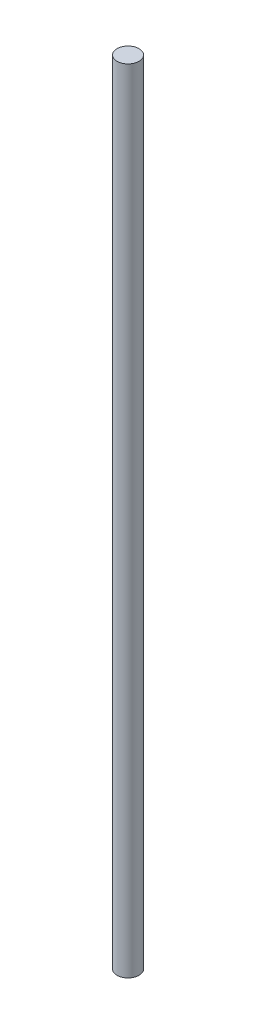
ISO-10303-21;
HEADER;
FILE_DESCRIPTION(('STEP AP214'),'2;1');
FILE_NAME('part.step','',(''),(''),'','','');
FILE_SCHEMA(('AUTOMOTIVE_DESIGN { 1 0 10303 214 1 1 1 1 }'));
ENDSEC;
DATA;
#1=APPLICATION_CONTEXT('core data for automotive mechanical design processes');
#2=APPLICATION_PROTOCOL_DEFINITION('international standard','automotive_design',2000,#1);
#3=PRODUCT_CONTEXT('',#1,'mechanical');
#4=PRODUCT('Part','Part','',(#3));
#5=PRODUCT_RELATED_PRODUCT_CATEGORY('part','',(#4));
#6=PRODUCT_DEFINITION_FORMATION('','',#4);
#7=PRODUCT_DEFINITION_CONTEXT('part definition',#1,'design');
#8=PRODUCT_DEFINITION('design','',#6,#7);
#9=PRODUCT_DEFINITION_SHAPE('','',#8);
#10=(LENGTH_UNIT() NAMED_UNIT(*) SI_UNIT(.MILLI.,.METRE.));
#11=(NAMED_UNIT(*) PLANE_ANGLE_UNIT() SI_UNIT($,.RADIAN.));
#12=(NAMED_UNIT(*) SI_UNIT($,.STERADIAN.) SOLID_ANGLE_UNIT());
#13=UNCERTAINTY_MEASURE_WITH_UNIT(LENGTH_MEASURE(1.E-05),#10,'distance_accuracy_value','');
#14=(GEOMETRIC_REPRESENTATION_CONTEXT(3) GLOBAL_UNCERTAINTY_ASSIGNED_CONTEXT((#13)) GLOBAL_UNIT_ASSIGNED_CONTEXT((#10,
#11,#12)) REPRESENTATION_CONTEXT('',''));
#15=CARTESIAN_POINT('',(0.,0.,0.));
#16=DIRECTION('',(0.,0.,1.));
#17=DIRECTION('',(1.,0.,0.));
#18=AXIS2_PLACEMENT_3D('',#15,#16,#17);
#19=CARTESIAN_POINT('',(0.,180.,0.));
#20=DIRECTION('',(0.,-1.,0.));
#21=DIRECTION('',(0.,0.,-1.));
#22=AXIS2_PLACEMENT_3D('',#19,#20,#21);
#23=CYLINDRICAL_SURFACE('',#22,2.5);
#24=CARTESIAN_POINT('',(0.,180.,0.));
#25=DIRECTION('',(0.,1.,0.));
#26=DIRECTION('',(0.,0.,1.));
#27=AXIS2_PLACEMENT_3D('',#24,#25,#26);
#28=CIRCLE('',#27,2.5);
#29=CARTESIAN_POINT('',(0.,180.,-2.5));
#30=VERTEX_POINT('',#29);
#31=EDGE_CURVE('E10',#30,#30,#28,.T.);
#32=CARTESIAN_POINT('',(0.,0.,0.));
#33=DIRECTION('',(0.,1.,0.));
#34=DIRECTION('',(0.,0.,1.));
#35=AXIS2_PLACEMENT_3D('',#32,#33,#34);
#36=CIRCLE('',#35,2.5);
#37=CARTESIAN_POINT('',(0.,0.,-2.5));
#38=VERTEX_POINT('',#37);
#39=EDGE_CURVE('E36',#38,#38,#36,.T.);
#40=CARTESIAN_POINT('',(0.,180.,-2.5));
#41=CARTESIAN_POINT('',(0.,178.125,-2.5));
#42=CARTESIAN_POINT('',(0.,176.25,-2.5));
#43=CARTESIAN_POINT('',(0.,172.5,-2.5));
#44=CARTESIAN_POINT('',(0.,170.625,-2.5));
#45=CARTESIAN_POINT('',(0.,166.875,-2.5));
#46=CARTESIAN_POINT('',(0.,165.,-2.5));
#47=CARTESIAN_POINT('',(0.,161.25,-2.5));
#48=CARTESIAN_POINT('',(0.,159.375,-2.5));
#49=CARTESIAN_POINT('',(0.,155.625,-2.5));
#50=CARTESIAN_POINT('',(0.,153.75,-2.5));
#51=CARTESIAN_POINT('',(0.,150.,-2.5));
#52=CARTESIAN_POINT('',(0.,148.125,-2.5));
#53=CARTESIAN_POINT('',(0.,144.375,-2.5));
#54=CARTESIAN_POINT('',(0.,142.5,-2.5));
#55=CARTESIAN_POINT('',(0.,138.75,-2.5));
#56=CARTESIAN_POINT('',(0.,136.875,-2.5));
#57=CARTESIAN_POINT('',(0.,133.125,-2.5));
#58=CARTESIAN_POINT('',(0.,131.25,-2.5));
#59=CARTESIAN_POINT('',(0.,127.5,-2.5));
#60=CARTESIAN_POINT('',(0.,125.625,-2.5));
#61=CARTESIAN_POINT('',(0.,121.875,-2.5));
#62=CARTESIAN_POINT('',(0.,120.,-2.5));
#63=CARTESIAN_POINT('',(0.,116.25,-2.5));
#64=CARTESIAN_POINT('',(0.,114.375,-2.5));
#65=CARTESIAN_POINT('',(0.,110.625,-2.5));
#66=CARTESIAN_POINT('',(0.,108.75,-2.5));
#67=CARTESIAN_POINT('',(0.,105.,-2.5));
#68=CARTESIAN_POINT('',(0.,103.125,-2.5));
#69=CARTESIAN_POINT('',(0.,99.375,-2.5));
#70=CARTESIAN_POINT('',(0.,97.5,-2.5));
#71=CARTESIAN_POINT('',(0.,93.75,-2.5));
#72=CARTESIAN_POINT('',(0.,91.875,-2.5));
#73=CARTESIAN_POINT('',(0.,88.125,-2.5));
#74=CARTESIAN_POINT('',(0.,86.25,-2.5));
#75=CARTESIAN_POINT('',(0.,82.5,-2.5));
#76=CARTESIAN_POINT('',(0.,80.625,-2.5));
#77=CARTESIAN_POINT('',(0.,76.875,-2.5));
#78=CARTESIAN_POINT('',(0.,75.,-2.5));
#79=CARTESIAN_POINT('',(0.,71.25,-2.5));
#80=CARTESIAN_POINT('',(0.,69.375,-2.5));
#81=CARTESIAN_POINT('',(0.,65.625,-2.5));
#82=CARTESIAN_POINT('',(0.,63.75,-2.5));
#83=CARTESIAN_POINT('',(0.,60.,-2.5));
#84=CARTESIAN_POINT('',(0.,58.125,-2.5));
#85=CARTESIAN_POINT('',(0.,54.375,-2.5));
#86=CARTESIAN_POINT('',(0.,52.5,-2.5));
#87=CARTESIAN_POINT('',(0.,48.75,-2.5));
#88=CARTESIAN_POINT('',(0.,46.875,-2.5));
#89=CARTESIAN_POINT('',(0.,43.125,-2.5));
#90=CARTESIAN_POINT('',(0.,41.25,-2.5));
#91=CARTESIAN_POINT('',(0.,37.5,-2.5));
#92=CARTESIAN_POINT('',(0.,35.625,-2.5));
#93=CARTESIAN_POINT('',(0.,31.875,-2.5));
#94=CARTESIAN_POINT('',(0.,30.,-2.5));
#95=CARTESIAN_POINT('',(0.,26.25,-2.5));
#96=CARTESIAN_POINT('',(0.,24.375,-2.5));
#97=CARTESIAN_POINT('',(0.,20.625,-2.5));
#98=CARTESIAN_POINT('',(0.,18.75,-2.5));
#99=CARTESIAN_POINT('',(0.,15.,-2.5));
#100=CARTESIAN_POINT('',(0.,13.125,-2.5));
#101=CARTESIAN_POINT('',(0.,9.37499999999998,-2.5));
#102=CARTESIAN_POINT('',(0.,7.49999999999997,-2.5));
#103=CARTESIAN_POINT('',(0.,3.74999999999997,-2.5));
#104=CARTESIAN_POINT('',(0.,1.87499999999997,-2.5));
#105=CARTESIAN_POINT('',(0.,0.,-2.5));
#106=B_SPLINE_CURVE_WITH_KNOTS('',3,(#40,#41,#42,#43,#44,#45,#46,#47,#48,#49,#50,#51,#52,#53,
#54,#55,#56,#57,#58,#59,#60,#61,#62,#63,#64,#65,#66,#67,#68,#69,#70,#71,#72,#73,#74,#75,#76,#77,
#78,#79,#80,#81,#82,#83,#84,#85,#86,#87,#88,#89,#90,#91,#92,#93,#94,#95,#96,#97,#98,#99,#100,
#101,#102,#103,#104,#105),.UNSPECIFIED.,.F.,.F.,(4,2,2,2,2,2,2,2,2,2,2,2,2,2,2,2,2,2,2,2,2,2,2,
2,2,2,2,2,2,2,2,2,4),(0.,5.62499999999999,11.25,16.875,22.5,28.125,33.75,39.375,45.,50.625,
56.25,61.875,67.5,73.125,78.75,84.375,90.,95.625,101.25,106.875,112.5,118.125,123.75,129.375,
135.,140.625,146.25,151.875,157.5,163.125,168.75,174.375,180.),.UNSPECIFIED.);
#107=EDGE_CURVE('BSEAM33',#30,#38,#106,.T.);
#108=ORIENTED_EDGE('',*,*,#31,.F.);
#109=ORIENTED_EDGE('',*,*,#39,.T.);
#110=ORIENTED_EDGE('',*,*,#107,.T.);
#111=ORIENTED_EDGE('',*,*,#107,.F.);
#112=EDGE_LOOP('',(#108,#110,#109,#111));
#113=FACE_BOUND('',#112,.T.);
#114=ADVANCED_FACE('F33',(#113),#23,.T.);
#115=CARTESIAN_POINT('',(0.,180.,0.));
#116=DIRECTION('',(0.,1.,0.));
#117=DIRECTION('',(0.,0.,1.));
#118=AXIS2_PLACEMENT_3D('',#115,#116,#117);
#119=PLANE('',#118);
#120=ORIENTED_EDGE('',*,*,#31,.T.);
#121=EDGE_LOOP('',(#120));
#122=FACE_BOUND('',#121,.T.);
#123=ADVANCED_FACE('F48',(#122),#119,.T.);
#124=CARTESIAN_POINT('',(0.,0.,0.));
#125=DIRECTION('',(0.,1.,0.));
#126=DIRECTION('',(0.,0.,1.));
#127=AXIS2_PLACEMENT_3D('',#124,#125,#126);
#128=PLANE('',#127);
#129=ORIENTED_EDGE('',*,*,#39,.F.);
#130=EDGE_LOOP('',(#129));
#131=FACE_BOUND('',#130,.T.);
#132=ADVANCED_FACE('F46',(#131),#128,.F.);
#133=CLOSED_SHELL('',(#114,#123,#132));
#134=MANIFOLD_SOLID_BREP('B2',#133);
#135=ADVANCED_BREP_SHAPE_REPRESENTATION('',(#18,#134),#14);
#136=SHAPE_DEFINITION_REPRESENTATION(#9,#135);
ENDSEC;
END-ISO-10303-21;
